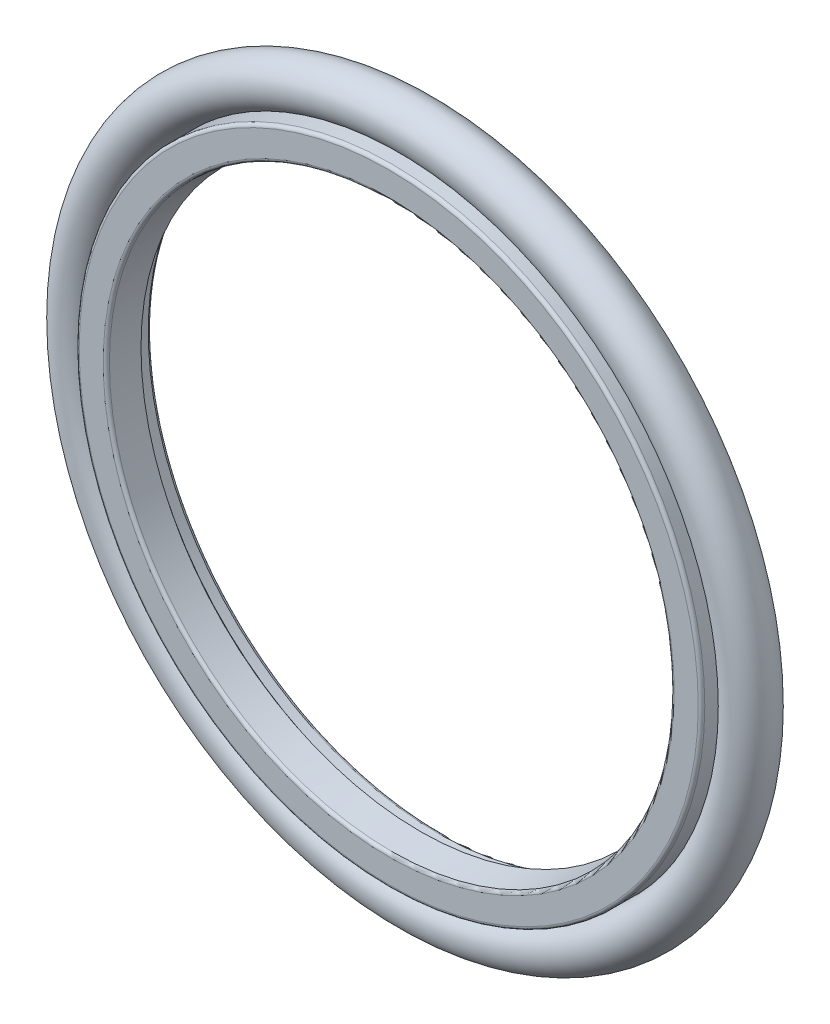
ISO-10303-21;
HEADER;
FILE_DESCRIPTION(('STEP AP214'),'2;1');
FILE_NAME('part.step','',(''),(''),'','','');
FILE_SCHEMA(('AUTOMOTIVE_DESIGN { 1 0 10303 214 1 1 1 1 }'));
ENDSEC;
DATA;
#1=APPLICATION_CONTEXT('core data for automotive mechanical design processes');
#2=APPLICATION_PROTOCOL_DEFINITION('international standard','automotive_design',2000,#1);
#3=PRODUCT_CONTEXT('',#1,'mechanical');
#4=PRODUCT('Part','Part','',(#3));
#5=PRODUCT_RELATED_PRODUCT_CATEGORY('part','',(#4));
#6=PRODUCT_DEFINITION_FORMATION('','',#4);
#7=PRODUCT_DEFINITION_CONTEXT('part definition',#1,'design');
#8=PRODUCT_DEFINITION('design','',#6,#7);
#9=PRODUCT_DEFINITION_SHAPE('','',#8);
#10=(LENGTH_UNIT() NAMED_UNIT(*) SI_UNIT(.MILLI.,.METRE.));
#11=(NAMED_UNIT(*) PLANE_ANGLE_UNIT() SI_UNIT($,.RADIAN.));
#12=(NAMED_UNIT(*) SI_UNIT($,.STERADIAN.) SOLID_ANGLE_UNIT());
#13=UNCERTAINTY_MEASURE_WITH_UNIT(LENGTH_MEASURE(1.E-05),#10,'distance_accuracy_value','');
#14=(GEOMETRIC_REPRESENTATION_CONTEXT(3) GLOBAL_UNCERTAINTY_ASSIGNED_CONTEXT((#13)) GLOBAL_UNIT_ASSIGNED_CONTEXT((#10,
#11,#12)) REPRESENTATION_CONTEXT('',''));
#15=CARTESIAN_POINT('',(0.,0.,0.));
#16=DIRECTION('',(0.,0.,1.));
#17=DIRECTION('',(1.,0.,0.));
#18=AXIS2_PLACEMENT_3D('',#15,#16,#17);
#19=CARTESIAN_POINT('',(0.,0.,-2.));
#20=DIRECTION('',(0.,0.,1.));
#21=DIRECTION('',(1.,0.,0.));
#22=AXIS2_PLACEMENT_3D('',#19,#20,#21);
#23=TOROIDAL_SURFACE('',#22,25.55,1.75);
#24=CARTESIAN_POINT('',(27.3,0.,-2.));
#25=VERTEX_POINT('',#24);
#26=VERTEX_LOOP('',#25);
#27=FACE_BOUND('',#26,.T.);
#28=ADVANCED_FACE('F51',(#27),#23,.T.);
#29=CLOSED_SHELL('',(#28));
#30=MANIFOLD_SOLID_BREP('B2',#29);
#31=CARTESIAN_POINT('',(0.,0.,-0.25));
#32=DIRECTION('',(0.,0.,1.));
#33=DIRECTION('',(1.,0.,0.));
#34=AXIS2_PLACEMENT_3D('',#31,#32,#33);
#35=TOROIDAL_SURFACE('',#34,21.7253110106669,0.249999999999999);
#36=CARTESIAN_POINT('',(0.,0.,-0.224098478935137));
#37=DIRECTION('',(0.,0.,1.));
#38=DIRECTION('',(1.,0.,0.));
#39=AXIS2_PLACEMENT_3D('',#36,#37,#38);
#40=CIRCLE('',#39,21.4766564084443);
#41=CARTESIAN_POINT('',(21.4766564084443,0.,-0.224098478935137));
#42=VERTEX_POINT('',#41);
#43=EDGE_CURVE('E50',#42,#42,#40,.T.);
#44=ORIENTED_EDGE('',*,*,#43,.F.);
#45=EDGE_LOOP('',(#44));
#46=FACE_BOUND('',#45,.T.);
#47=CARTESIAN_POINT('',(0.,0.,0.));
#48=DIRECTION('',(0.,0.,1.));
#49=DIRECTION('',(1.,0.,0.));
#50=AXIS2_PLACEMENT_3D('',#47,#48,#49);
#51=CIRCLE('',#50,21.7253110106669);
#52=CARTESIAN_POINT('',(21.7253110106669,0.,0.));
#53=VERTEX_POINT('',#52);
#54=EDGE_CURVE('E102',#53,#53,#51,.T.);
#55=ORIENTED_EDGE('',*,*,#54,.T.);
#56=EDGE_LOOP('',(#55));
#57=FACE_BOUND('',#56,.T.);
#58=ADVANCED_FACE('F68',(#46,#57),#35,.T.);
#59=CARTESIAN_POINT('',(0.,0.,-0.224098478935137));
#60=DIRECTION('',(0.,0.,1.));
#61=DIRECTION('',(1.,0.,0.));
#62=AXIS2_PLACEMENT_3D('',#59,#60,#61);
#63=CONICAL_SURFACE('',#62,21.4766564084443,0.103792340457041);
#64=CARTESIAN_POINT('',(0.,0.,-2.4));
#65=DIRECTION('',(0.,0.,1.));
#66=DIRECTION('',(1.,0.,0.));
#67=AXIS2_PLACEMENT_3D('',#64,#65,#66);
#68=CIRCLE('',#67,21.25);
#69=CARTESIAN_POINT('',(21.25,0.,-2.4));
#70=VERTEX_POINT('',#69);
#71=EDGE_CURVE('E74',#70,#70,#68,.T.);
#72=ORIENTED_EDGE('',*,*,#71,.F.);
#73=EDGE_LOOP('',(#72));
#74=FACE_BOUND('',#73,.T.);
#75=ORIENTED_EDGE('',*,*,#43,.T.);
#76=EDGE_LOOP('',(#75));
#77=FACE_BOUND('',#76,.T.);
#78=ADVANCED_FACE('F151',(#74,#77),#63,.F.);
#79=CARTESIAN_POINT('',(0.,0.,-2.4));
#80=DIRECTION('',(0.,0.,-1.));
#81=DIRECTION('',(-1.,0.,0.));
#82=AXIS2_PLACEMENT_3D('',#79,#80,#81);
#83=CONICAL_SURFACE('',#82,21.25,0.927295218001612);
#84=CARTESIAN_POINT('',(0.,0.,-3.));
#85=DIRECTION('',(0.,0.,1.));
#86=DIRECTION('',(1.,0.,0.));
#87=AXIS2_PLACEMENT_3D('',#84,#85,#86);
#88=CIRCLE('',#87,22.05);
#89=CARTESIAN_POINT('',(22.05,0.,-3.));
#90=VERTEX_POINT('',#89);
#91=EDGE_CURVE('E78',#90,#90,#88,.T.);
#92=ORIENTED_EDGE('',*,*,#91,.F.);
#93=EDGE_LOOP('',(#92));
#94=FACE_BOUND('',#93,.T.);
#95=ORIENTED_EDGE('',*,*,#71,.T.);
#96=EDGE_LOOP('',(#95));
#97=FACE_BOUND('',#96,.T.);
#98=ADVANCED_FACE('F146',(#94,#97),#83,.F.);
#99=CARTESIAN_POINT('',(0.,0.,0.));
#100=DIRECTION('',(0.,0.,1.));
#101=DIRECTION('',(1.,0.,0.));
#102=AXIS2_PLACEMENT_3D('',#99,#100,#101);
#103=CYLINDRICAL_SURFACE('',#102,22.05);
#104=CARTESIAN_POINT('',(0.,0.,-3.75));
#105=DIRECTION('',(0.,0.,1.));
#106=DIRECTION('',(1.,0.,0.));
#107=AXIS2_PLACEMENT_3D('',#104,#105,#106);
#108=CIRCLE('',#107,22.05);
#109=CARTESIAN_POINT('',(22.05,0.,-3.75));
#110=VERTEX_POINT('',#109);
#111=EDGE_CURVE('E82',#110,#110,#108,.T.);
#112=ORIENTED_EDGE('',*,*,#111,.F.);
#113=EDGE_LOOP('',(#112));
#114=FACE_BOUND('',#113,.T.);
#115=ORIENTED_EDGE('',*,*,#91,.T.);
#116=EDGE_LOOP('',(#115));
#117=FACE_BOUND('',#116,.T.);
#118=ADVANCED_FACE('F140',(#114,#117),#103,.F.);
#119=CARTESIAN_POINT('',(0.,0.,-3.75));
#120=DIRECTION('',(0.,0.,1.));
#121=DIRECTION('',(1.,0.,0.));
#122=AXIS2_PLACEMENT_3D('',#119,#120,#121);
#123=TOROIDAL_SURFACE('',#122,22.3,0.25);
#124=CARTESIAN_POINT('',(0.,0.,-4.));
#125=DIRECTION('',(0.,0.,1.));
#126=DIRECTION('',(1.,0.,0.));
#127=AXIS2_PLACEMENT_3D('',#124,#125,#126);
#128=CIRCLE('',#127,22.3);
#129=CARTESIAN_POINT('',(22.3,0.,-4.));
#130=VERTEX_POINT('',#129);
#131=EDGE_CURVE('E87',#130,#130,#128,.T.);
#132=ORIENTED_EDGE('',*,*,#131,.F.);
#133=EDGE_LOOP('',(#132));
#134=FACE_BOUND('',#133,.T.);
#135=ORIENTED_EDGE('',*,*,#111,.T.);
#136=EDGE_LOOP('',(#135));
#137=FACE_BOUND('',#136,.T.);
#138=ADVANCED_FACE('F134',(#134,#137),#123,.T.);
#139=CARTESIAN_POINT('',(0.,23.55,-4.));
#140=DIRECTION('',(0.,0.,1.));
#141=DIRECTION('',(1.,0.,0.));
#142=AXIS2_PLACEMENT_3D('',#139,#140,#141);
#143=PLANE('',#142);
#144=CARTESIAN_POINT('',(0.,0.,-4.));
#145=DIRECTION('',(0.,0.,1.));
#146=DIRECTION('',(1.,0.,0.));
#147=AXIS2_PLACEMENT_3D('',#144,#145,#146);
#148=CIRCLE('',#147,23.55);
#149=CARTESIAN_POINT('',(23.55,0.,-4.));
#150=VERTEX_POINT('',#149);
#151=EDGE_CURVE('E90',#150,#150,#148,.T.);
#152=ORIENTED_EDGE('',*,*,#151,.F.);
#153=EDGE_LOOP('',(#152));
#154=FACE_BOUND('',#153,.T.);
#155=ORIENTED_EDGE('',*,*,#131,.T.);
#156=EDGE_LOOP('',(#155));
#157=FACE_BOUND('',#156,.T.);
#158=ADVANCED_FACE('F128',(#154,#157),#143,.F.);
#159=CARTESIAN_POINT('',(0.,0.,-3.75));
#160=DIRECTION('',(0.,0.,1.));
#161=DIRECTION('',(1.,0.,0.));
#162=AXIS2_PLACEMENT_3D('',#159,#160,#161);
#163=TOROIDAL_SURFACE('',#162,23.55,0.25);
#164=CARTESIAN_POINT('',(0.,0.,-3.75));
#165=DIRECTION('',(0.,0.,1.));
#166=DIRECTION('',(1.,0.,0.));
#167=AXIS2_PLACEMENT_3D('',#164,#165,#166);
#168=CIRCLE('',#167,23.8);
#169=CARTESIAN_POINT('',(23.8,0.,-3.75));
#170=VERTEX_POINT('',#169);
#171=EDGE_CURVE('E93',#170,#170,#168,.T.);
#172=ORIENTED_EDGE('',*,*,#171,.F.);
#173=EDGE_LOOP('',(#172));
#174=FACE_BOUND('',#173,.T.);
#175=ORIENTED_EDGE('',*,*,#151,.T.);
#176=EDGE_LOOP('',(#175));
#177=FACE_BOUND('',#176,.T.);
#178=ADVANCED_FACE('F122',(#174,#177),#163,.T.);
#179=CARTESIAN_POINT('',(0.,0.,0.));
#180=DIRECTION('',(0.,0.,1.));
#181=DIRECTION('',(1.,0.,0.));
#182=AXIS2_PLACEMENT_3D('',#179,#180,#181);
#183=CYLINDRICAL_SURFACE('',#182,23.8);
#184=CARTESIAN_POINT('',(0.,0.,-0.25));
#185=DIRECTION('',(0.,0.,1.));
#186=DIRECTION('',(1.,0.,0.));
#187=AXIS2_PLACEMENT_3D('',#184,#185,#186);
#188=CIRCLE('',#187,23.8);
#189=CARTESIAN_POINT('',(23.8,0.,-0.25));
#190=VERTEX_POINT('',#189);
#191=EDGE_CURVE('E96',#190,#190,#188,.T.);
#192=ORIENTED_EDGE('',*,*,#191,.F.);
#193=EDGE_LOOP('',(#192));
#194=FACE_BOUND('',#193,.T.);
#195=ORIENTED_EDGE('',*,*,#171,.T.);
#196=EDGE_LOOP('',(#195));
#197=FACE_BOUND('',#196,.T.);
#198=ADVANCED_FACE('F116',(#194,#197),#183,.T.);
#199=CARTESIAN_POINT('',(0.,0.,-0.25));
#200=DIRECTION('',(0.,0.,1.));
#201=DIRECTION('',(1.,0.,0.));
#202=AXIS2_PLACEMENT_3D('',#199,#200,#201);
#203=TOROIDAL_SURFACE('',#202,23.55,0.25);
#204=CARTESIAN_POINT('',(0.,0.,0.));
#205=DIRECTION('',(0.,0.,1.));
#206=DIRECTION('',(1.,0.,0.));
#207=AXIS2_PLACEMENT_3D('',#204,#205,#206);
#208=CIRCLE('',#207,23.55);
#209=CARTESIAN_POINT('',(23.55,0.,0.));
#210=VERTEX_POINT('',#209);
#211=EDGE_CURVE('E99',#210,#210,#208,.T.);
#212=ORIENTED_EDGE('',*,*,#211,.F.);
#213=EDGE_LOOP('',(#212));
#214=FACE_BOUND('',#213,.T.);
#215=ORIENTED_EDGE('',*,*,#191,.T.);
#216=EDGE_LOOP('',(#215));
#217=FACE_BOUND('',#216,.T.);
#218=ADVANCED_FACE('F110',(#214,#217),#203,.T.);
#219=CARTESIAN_POINT('',(0.,23.55,0.));
#220=DIRECTION('',(0.,0.,-1.));
#221=DIRECTION('',(-1.,0.,0.));
#222=AXIS2_PLACEMENT_3D('',#219,#220,#221);
#223=PLANE('',#222);
#224=ORIENTED_EDGE('',*,*,#54,.F.);
#225=EDGE_LOOP('',(#224));
#226=FACE_BOUND('',#225,.T.);
#227=ORIENTED_EDGE('',*,*,#211,.T.);
#228=EDGE_LOOP('',(#227));
#229=FACE_BOUND('',#228,.T.);
#230=ADVANCED_FACE('F107',(#226,#229),#223,.F.);
#231=CLOSED_SHELL('',(#58,#78,#98,#118,#138,#158,#178,#198,#218,#230));
#232=MANIFOLD_SOLID_BREP('B6',#231);
#233=ADVANCED_BREP_SHAPE_REPRESENTATION('',(#18,#30,#232),#14);
#234=SHAPE_DEFINITION_REPRESENTATION(#9,#233);
ENDSEC;
END-ISO-10303-21;
